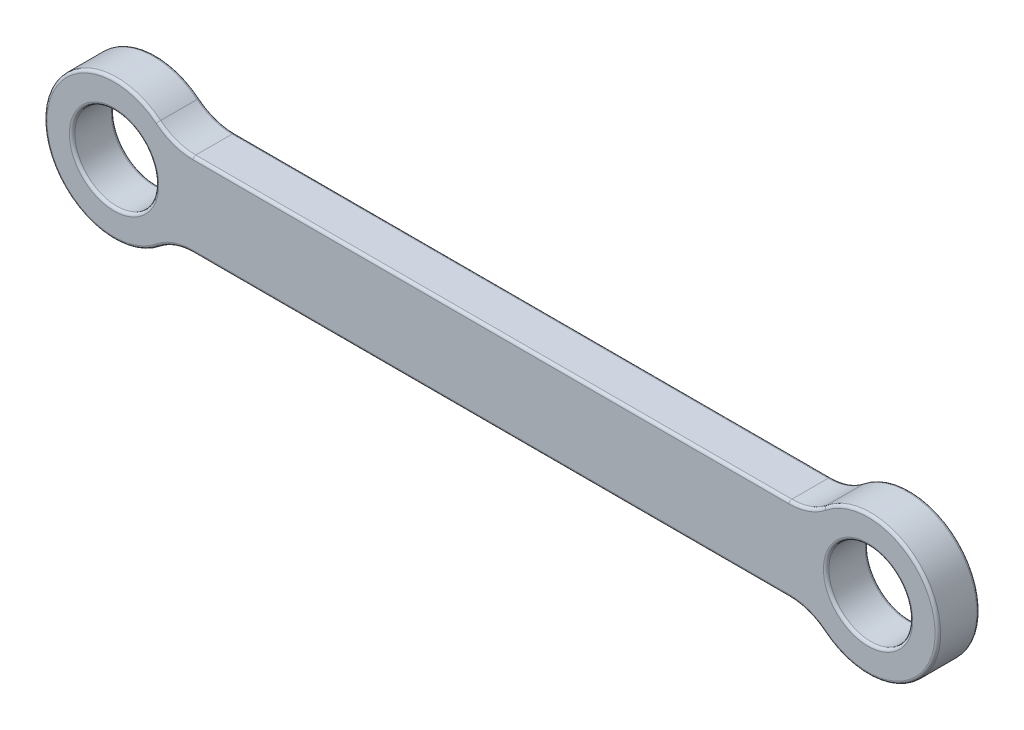
ISO-10303-21;
HEADER;
FILE_DESCRIPTION(('STEP AP214'),'2;1');
FILE_NAME('part.step','',(''),(''),'','','');
FILE_SCHEMA(('AUTOMOTIVE_DESIGN { 1 0 10303 214 1 1 1 1 }'));
ENDSEC;
DATA;
#1=APPLICATION_CONTEXT('core data for automotive mechanical design processes');
#2=APPLICATION_PROTOCOL_DEFINITION('international standard','automotive_design',2000,#1);
#3=PRODUCT_CONTEXT('',#1,'mechanical');
#4=PRODUCT('Part','Part','',(#3));
#5=PRODUCT_RELATED_PRODUCT_CATEGORY('part','',(#4));
#6=PRODUCT_DEFINITION_FORMATION('','',#4);
#7=PRODUCT_DEFINITION_CONTEXT('part definition',#1,'design');
#8=PRODUCT_DEFINITION('design','',#6,#7);
#9=PRODUCT_DEFINITION_SHAPE('','',#8);
#10=(LENGTH_UNIT() NAMED_UNIT(*) SI_UNIT(.MILLI.,.METRE.));
#11=(NAMED_UNIT(*) PLANE_ANGLE_UNIT() SI_UNIT($,.RADIAN.));
#12=(NAMED_UNIT(*) SI_UNIT($,.STERADIAN.) SOLID_ANGLE_UNIT());
#13=UNCERTAINTY_MEASURE_WITH_UNIT(LENGTH_MEASURE(1.E-05),#10,'distance_accuracy_value','');
#14=(GEOMETRIC_REPRESENTATION_CONTEXT(3) GLOBAL_UNCERTAINTY_ASSIGNED_CONTEXT((#13)) GLOBAL_UNIT_ASSIGNED_CONTEXT((#10,
#11,#12)) REPRESENTATION_CONTEXT('',''));
#15=CARTESIAN_POINT('',(0.,0.,0.));
#16=DIRECTION('',(0.,0.,1.));
#17=DIRECTION('',(1.,0.,0.));
#18=AXIS2_PLACEMENT_3D('',#15,#16,#17);
#19=CARTESIAN_POINT('',(0.,0.,3.));
#20=DIRECTION('',(0.,0.,-1.));
#21=DIRECTION('',(-1.,0.,0.));
#22=AXIS2_PLACEMENT_3D('',#19,#20,#21);
#23=CYLINDRICAL_SURFACE('',#22,5.);
#24=DIRECTION('',(0.,0.,-1.));
#25=VECTOR('',#24,1.);
#26=CARTESIAN_POINT('',(3.14269680527354,3.88888888888889,3.));
#27=LINE('',#26,#25);
#28=CARTESIAN_POINT('',(3.14269680527354,3.88888888888889,2.8));
#29=VERTEX_POINT('',#28);
#30=CARTESIAN_POINT('',(3.14269680527354,3.88888888888889,0.2));
#31=VERTEX_POINT('',#30);
#32=EDGE_CURVE('E304',#29,#31,#27,.T.);
#33=ORIENTED_EDGE('',*,*,#32,.T.);
#34=CARTESIAN_POINT('',(0.,0.,0.2));
#35=DIRECTION('',(0.,0.,1.));
#36=DIRECTION('',(1.,0.,0.));
#37=AXIS2_PLACEMENT_3D('',#34,#35,#36);
#38=CIRCLE('',#37,5.);
#39=CARTESIAN_POINT('',(3.14269680527354,-3.88888888888889,0.2));
#40=VERTEX_POINT('',#39);
#41=EDGE_CURVE('E218',#31,#40,#38,.T.);
#42=ORIENTED_EDGE('',*,*,#41,.T.);
#43=DIRECTION('',(0.,0.,-1.));
#44=VECTOR('',#43,1.);
#45=CARTESIAN_POINT('',(3.14269680527354,-3.88888888888889,3.));
#46=LINE('',#45,#44);
#47=CARTESIAN_POINT('',(3.14269680527354,-3.88888888888889,2.8));
#48=VERTEX_POINT('',#47);
#49=EDGE_CURVE('E297',#40,#48,#46,.F.);
#50=ORIENTED_EDGE('',*,*,#49,.T.);
#51=CARTESIAN_POINT('',(0.,0.,2.8));
#52=DIRECTION('',(0.,0.,1.));
#53=DIRECTION('',(1.,0.,0.));
#54=AXIS2_PLACEMENT_3D('',#51,#52,#53);
#55=CIRCLE('',#54,5.);
#56=EDGE_CURVE('E216',#48,#29,#55,.F.);
#57=ORIENTED_EDGE('',*,*,#56,.T.);
#58=EDGE_LOOP('',(#33,#42,#50,#57));
#59=FACE_BOUND('',#58,.T.);
#60=ADVANCED_FACE('F38',(#59),#23,.T.);
#61=CARTESIAN_POINT('',(0.,-3.,3.));
#62=DIRECTION('',(0.,-1.,0.));
#63=DIRECTION('',(0.,0.,-1.));
#64=AXIS2_PLACEMENT_3D('',#61,#62,#63);
#65=PLANE('',#64);
#66=DIRECTION('',(0.,0.,-1.));
#67=VECTOR('',#66,1.);
#68=CARTESIAN_POINT('',(5.65685424949238,-3.,3.));
#69=LINE('',#68,#67);
#70=CARTESIAN_POINT('',(5.65685424949238,-3.,2.8));
#71=VERTEX_POINT('',#70);
#72=CARTESIAN_POINT('',(5.65685424949238,-3.,0.2));
#73=VERTEX_POINT('',#72);
#74=EDGE_CURVE('E299',#71,#73,#69,.T.);
#75=ORIENTED_EDGE('',*,*,#74,.T.);
#76=DIRECTION('',(-1.,0.,0.));
#77=VECTOR('',#76,1.);
#78=CARTESIAN_POINT('',(48.3431457505076,-3.,0.2));
#79=LINE('',#78,#77);
#80=CARTESIAN_POINT('',(48.3431457505076,-3.,0.2));
#81=VERTEX_POINT('',#80);
#82=EDGE_CURVE('E193',#73,#81,#79,.F.);
#83=ORIENTED_EDGE('',*,*,#82,.T.);
#84=DIRECTION('',(0.,0.,1.));
#85=VECTOR('',#84,1.);
#86=CARTESIAN_POINT('',(48.3431457505076,-3.,3.));
#87=LINE('',#86,#85);
#88=CARTESIAN_POINT('',(48.3431457505076,-3.,2.8));
#89=VERTEX_POINT('',#88);
#90=EDGE_CURVE('E309',#81,#89,#87,.T.);
#91=ORIENTED_EDGE('',*,*,#90,.T.);
#92=DIRECTION('',(-1.,0.,0.));
#93=VECTOR('',#92,1.);
#94=CARTESIAN_POINT('',(0.,-3.,2.8));
#95=LINE('',#94,#93);
#96=EDGE_CURVE('E191',#89,#71,#95,.T.);
#97=ORIENTED_EDGE('',*,*,#96,.T.);
#98=EDGE_LOOP('',(#75,#83,#91,#97));
#99=FACE_BOUND('',#98,.T.);
#100=ADVANCED_FACE('F342',(#99),#65,.T.);
#101=CARTESIAN_POINT('',(54.,0.,3.));
#102=DIRECTION('',(0.,0.,-1.));
#103=DIRECTION('',(-1.,0.,0.));
#104=AXIS2_PLACEMENT_3D('',#101,#102,#103);
#105=CYLINDRICAL_SURFACE('',#104,5.);
#106=DIRECTION('',(0.,0.,-1.));
#107=VECTOR('',#106,1.);
#108=CARTESIAN_POINT('',(50.8573031947265,-3.88888888888889,3.));
#109=LINE('',#108,#107);
#110=CARTESIAN_POINT('',(50.8573031947265,-3.88888888888889,2.8));
#111=VERTEX_POINT('',#110);
#112=CARTESIAN_POINT('',(50.8573031947265,-3.88888888888889,0.2));
#113=VERTEX_POINT('',#112);
#114=EDGE_CURVE('E343',#111,#113,#109,.T.);
#115=ORIENTED_EDGE('',*,*,#114,.T.);
#116=CARTESIAN_POINT('',(54.,0.,0.2));
#117=DIRECTION('',(0.,0.,1.));
#118=DIRECTION('',(1.,0.,0.));
#119=AXIS2_PLACEMENT_3D('',#116,#117,#118);
#120=CIRCLE('',#119,5.);
#121=CARTESIAN_POINT('',(50.8573031947265,3.88888888888889,0.2));
#122=VERTEX_POINT('',#121);
#123=EDGE_CURVE('E201',#113,#122,#120,.T.);
#124=ORIENTED_EDGE('',*,*,#123,.T.);
#125=DIRECTION('',(0.,0.,-1.));
#126=VECTOR('',#125,1.);
#127=CARTESIAN_POINT('',(50.8573031947265,3.88888888888889,3.));
#128=LINE('',#127,#126);
#129=CARTESIAN_POINT('',(50.8573031947265,3.88888888888889,2.8));
#130=VERTEX_POINT('',#129);
#131=EDGE_CURVE('E259',#122,#130,#128,.F.);
#132=ORIENTED_EDGE('',*,*,#131,.T.);
#133=CARTESIAN_POINT('',(54.,0.,2.8));
#134=DIRECTION('',(0.,0.,1.));
#135=DIRECTION('',(1.,0.,0.));
#136=AXIS2_PLACEMENT_3D('',#133,#134,#135);
#137=CIRCLE('',#136,5.);
#138=EDGE_CURVE('E199',#130,#111,#137,.F.);
#139=ORIENTED_EDGE('',*,*,#138,.T.);
#140=EDGE_LOOP('',(#115,#124,#132,#139));
#141=FACE_BOUND('',#140,.T.);
#142=ADVANCED_FACE('F351',(#141),#105,.T.);
#143=CARTESIAN_POINT('',(0.,3.,3.));
#144=DIRECTION('',(0.,-1.,0.));
#145=DIRECTION('',(0.,0.,-1.));
#146=AXIS2_PLACEMENT_3D('',#143,#144,#145);
#147=PLANE('',#146);
#148=DIRECTION('',(0.,0.,-1.));
#149=VECTOR('',#148,1.);
#150=CARTESIAN_POINT('',(48.3431457505076,3.,3.));
#151=LINE('',#150,#149);
#152=CARTESIAN_POINT('',(48.3431457505076,3.,2.8));
#153=VERTEX_POINT('',#152);
#154=CARTESIAN_POINT('',(48.3431457505076,3.,0.2));
#155=VERTEX_POINT('',#154);
#156=EDGE_CURVE('E307',#153,#155,#151,.T.);
#157=ORIENTED_EDGE('',*,*,#156,.T.);
#158=DIRECTION('',(-1.,0.,0.));
#159=VECTOR('',#158,1.);
#160=CARTESIAN_POINT('',(0.,3.,0.2));
#161=LINE('',#160,#159);
#162=CARTESIAN_POINT('',(5.65685424949238,3.,0.2));
#163=VERTEX_POINT('',#162);
#164=EDGE_CURVE('E210',#155,#163,#161,.T.);
#165=ORIENTED_EDGE('',*,*,#164,.T.);
#166=DIRECTION('',(0.,0.,1.));
#167=VECTOR('',#166,1.);
#168=CARTESIAN_POINT('',(5.65685424949238,3.,3.));
#169=LINE('',#168,#167);
#170=CARTESIAN_POINT('',(5.65685424949238,3.,2.8));
#171=VERTEX_POINT('',#170);
#172=EDGE_CURVE('E303',#163,#171,#169,.T.);
#173=ORIENTED_EDGE('',*,*,#172,.T.);
#174=DIRECTION('',(-1.,0.,0.));
#175=VECTOR('',#174,1.);
#176=CARTESIAN_POINT('',(48.3431457505076,3.,2.8));
#177=LINE('',#176,#175);
#178=EDGE_CURVE('E208',#171,#153,#177,.F.);
#179=ORIENTED_EDGE('',*,*,#178,.T.);
#180=EDGE_LOOP('',(#157,#165,#173,#179));
#181=FACE_BOUND('',#180,.T.);
#182=ADVANCED_FACE('F391',(#181),#147,.F.);
#183=CARTESIAN_POINT('',(0.,0.,3.));
#184=DIRECTION('',(0.,0.,-1.));
#185=DIRECTION('',(-1.,0.,0.));
#186=AXIS2_PLACEMENT_3D('',#183,#184,#185);
#187=CYLINDRICAL_SURFACE('',#186,3.);
#188=CARTESIAN_POINT('',(0.,0.,0.2));
#189=DIRECTION('',(0.,0.,1.));
#190=DIRECTION('',(1.,0.,0.));
#191=AXIS2_PLACEMENT_3D('',#188,#189,#190);
#192=CIRCLE('',#191,3.);
#193=CARTESIAN_POINT('',(3.,0.,0.2));
#194=VERTEX_POINT('',#193);
#195=EDGE_CURVE('E223',#194,#194,#192,.F.);
#196=ORIENTED_EDGE('',*,*,#195,.T.);
#197=EDGE_LOOP('',(#196));
#198=FACE_BOUND('',#197,.T.);
#199=CARTESIAN_POINT('',(0.,0.,2.8));
#200=DIRECTION('',(0.,0.,1.));
#201=DIRECTION('',(1.,0.,0.));
#202=AXIS2_PLACEMENT_3D('',#199,#200,#201);
#203=CIRCLE('',#202,3.);
#204=CARTESIAN_POINT('',(3.,0.,2.8));
#205=VERTEX_POINT('',#204);
#206=EDGE_CURVE('E220',#205,#205,#203,.T.);
#207=ORIENTED_EDGE('',*,*,#206,.T.);
#208=EDGE_LOOP('',(#207));
#209=FACE_BOUND('',#208,.T.);
#210=ADVANCED_FACE('F387',(#198,#209),#187,.F.);
#211=CARTESIAN_POINT('',(54.,0.,3.));
#212=DIRECTION('',(0.,0.,-1.));
#213=DIRECTION('',(-1.,0.,0.));
#214=AXIS2_PLACEMENT_3D('',#211,#212,#213);
#215=CYLINDRICAL_SURFACE('',#214,3.);
#216=CARTESIAN_POINT('',(54.,0.,0.2));
#217=DIRECTION('',(0.,0.,1.));
#218=DIRECTION('',(1.,0.,0.));
#219=AXIS2_PLACEMENT_3D('',#216,#217,#218);
#220=CIRCLE('',#219,3.);
#221=CARTESIAN_POINT('',(57.,0.,0.2));
#222=VERTEX_POINT('',#221);
#223=EDGE_CURVE('E318',#222,#222,#220,.F.);
#224=ORIENTED_EDGE('',*,*,#223,.T.);
#225=EDGE_LOOP('',(#224));
#226=FACE_BOUND('',#225,.T.);
#227=CARTESIAN_POINT('',(54.,0.,2.8));
#228=DIRECTION('',(0.,0.,1.));
#229=DIRECTION('',(1.,0.,0.));
#230=AXIS2_PLACEMENT_3D('',#227,#228,#229);
#231=CIRCLE('',#230,3.);
#232=CARTESIAN_POINT('',(57.,0.,2.8));
#233=VERTEX_POINT('',#232);
#234=EDGE_CURVE('E315',#233,#233,#231,.T.);
#235=ORIENTED_EDGE('',*,*,#234,.T.);
#236=EDGE_LOOP('',(#235));
#237=FACE_BOUND('',#236,.T.);
#238=ADVANCED_FACE('F390',(#226,#237),#215,.F.);
#239=CARTESIAN_POINT('',(0.,0.,3.));
#240=DIRECTION('',(0.,0.,1.));
#241=DIRECTION('',(1.,0.,0.));
#242=AXIS2_PLACEMENT_3D('',#239,#240,#241);
#243=PLANE('',#242);
#244=CARTESIAN_POINT('',(54.,0.,3.));
#245=DIRECTION('',(0.,0.,1.));
#246=DIRECTION('',(1.,0.,0.));
#247=AXIS2_PLACEMENT_3D('',#244,#245,#246);
#248=CIRCLE('',#247,3.2);
#249=CARTESIAN_POINT('',(57.2,0.,3.));
#250=VERTEX_POINT('',#249);
#251=EDGE_CURVE('E11',#250,#250,#248,.F.);
#252=ORIENTED_EDGE('',*,*,#251,.T.);
#253=EDGE_LOOP('',(#252));
#254=FACE_BOUND('',#253,.T.);
#255=CARTESIAN_POINT('',(54.,0.,3.));
#256=DIRECTION('',(0.,0.,1.));
#257=DIRECTION('',(1.,0.,0.));
#258=AXIS2_PLACEMENT_3D('',#255,#256,#257);
#259=CIRCLE('',#258,4.8);
#260=CARTESIAN_POINT('',(50.9830110669374,-3.73333333333333,3.));
#261=VERTEX_POINT('',#260);
#262=CARTESIAN_POINT('',(50.9830110669374,3.73333333333333,3.));
#263=VERTEX_POINT('',#262);
#264=EDGE_CURVE('E55',#261,#263,#259,.T.);
#265=ORIENTED_EDGE('',*,*,#264,.T.);
#266=CARTESIAN_POINT('',(48.3431457505076,7.,3.));
#267=DIRECTION('',(0.,0.,1.));
#268=DIRECTION('',(1.,0.,0.));
#269=AXIS2_PLACEMENT_3D('',#266,#267,#268);
#270=CIRCLE('',#269,4.2);
#271=CARTESIAN_POINT('',(48.3431457505076,2.8,3.));
#272=VERTEX_POINT('',#271);
#273=EDGE_CURVE('E47',#263,#272,#270,.F.);
#274=ORIENTED_EDGE('',*,*,#273,.T.);
#275=DIRECTION('',(-1.,0.,0.));
#276=VECTOR('',#275,1.);
#277=CARTESIAN_POINT('',(5.65685424949238,2.8,3.));
#278=LINE('',#277,#276);
#279=CARTESIAN_POINT('',(5.65685424949238,2.8,3.));
#280=VERTEX_POINT('',#279);
#281=EDGE_CURVE('E229',#272,#280,#278,.T.);
#282=ORIENTED_EDGE('',*,*,#281,.T.);
#283=CARTESIAN_POINT('',(5.65685424949238,7.,3.));
#284=DIRECTION('',(0.,0.,1.));
#285=DIRECTION('',(1.,0.,0.));
#286=AXIS2_PLACEMENT_3D('',#283,#284,#285);
#287=CIRCLE('',#286,4.2);
#288=CARTESIAN_POINT('',(3.0169889330626,3.73333333333333,3.));
#289=VERTEX_POINT('',#288);
#290=EDGE_CURVE('E231',#280,#289,#287,.F.);
#291=ORIENTED_EDGE('',*,*,#290,.T.);
#292=CARTESIAN_POINT('',(0.,0.,3.));
#293=DIRECTION('',(0.,0.,1.));
#294=DIRECTION('',(1.,0.,0.));
#295=AXIS2_PLACEMENT_3D('',#292,#293,#294);
#296=CIRCLE('',#295,4.8);
#297=CARTESIAN_POINT('',(3.0169889330626,-3.73333333333333,3.));
#298=VERTEX_POINT('',#297);
#299=EDGE_CURVE('E233',#289,#298,#296,.T.);
#300=ORIENTED_EDGE('',*,*,#299,.T.);
#301=CARTESIAN_POINT('',(5.65685424949238,-7.,3.));
#302=DIRECTION('',(0.,0.,1.));
#303=DIRECTION('',(1.,0.,0.));
#304=AXIS2_PLACEMENT_3D('',#301,#302,#303);
#305=CIRCLE('',#304,4.2);
#306=CARTESIAN_POINT('',(5.65685424949238,-2.8,3.));
#307=VERTEX_POINT('',#306);
#308=EDGE_CURVE('E235',#298,#307,#305,.F.);
#309=ORIENTED_EDGE('',*,*,#308,.T.);
#310=DIRECTION('',(-1.,0.,0.));
#311=VECTOR('',#310,1.);
#312=CARTESIAN_POINT('',(0.,-2.8,3.));
#313=LINE('',#312,#311);
#314=CARTESIAN_POINT('',(48.3431457505076,-2.8,3.));
#315=VERTEX_POINT('',#314);
#316=EDGE_CURVE('E237',#307,#315,#313,.F.);
#317=ORIENTED_EDGE('',*,*,#316,.T.);
#318=CARTESIAN_POINT('',(48.3431457505076,-7.,3.));
#319=DIRECTION('',(0.,0.,1.));
#320=DIRECTION('',(1.,0.,0.));
#321=AXIS2_PLACEMENT_3D('',#318,#319,#320);
#322=CIRCLE('',#321,4.2);
#323=EDGE_CURVE('E60',#315,#261,#322,.F.);
#324=ORIENTED_EDGE('',*,*,#323,.T.);
#325=EDGE_LOOP('',(#265,#274,#282,#291,#300,#309,#317,#324));
#326=FACE_BOUND('',#325,.T.);
#327=CARTESIAN_POINT('',(0.,0.,3.));
#328=DIRECTION('',(0.,0.,1.));
#329=DIRECTION('',(1.,0.,0.));
#330=AXIS2_PLACEMENT_3D('',#327,#328,#329);
#331=CIRCLE('',#330,3.2);
#332=CARTESIAN_POINT('',(3.2,0.,3.));
#333=VERTEX_POINT('',#332);
#334=EDGE_CURVE('E226',#333,#333,#331,.F.);
#335=ORIENTED_EDGE('',*,*,#334,.T.);
#336=EDGE_LOOP('',(#335));
#337=FACE_BOUND('',#336,.T.);
#338=ADVANCED_FACE('F597',(#254,#326,#337),#243,.T.);
#339=CARTESIAN_POINT('',(0.,0.,0.));
#340=DIRECTION('',(0.,0.,1.));
#341=DIRECTION('',(1.,0.,0.));
#342=AXIS2_PLACEMENT_3D('',#339,#340,#341);
#343=PLANE('',#342);
#344=CARTESIAN_POINT('',(54.,0.,0.));
#345=DIRECTION('',(0.,0.,1.));
#346=DIRECTION('',(1.,0.,0.));
#347=AXIS2_PLACEMENT_3D('',#344,#345,#346);
#348=CIRCLE('',#347,3.2);
#349=CARTESIAN_POINT('',(57.2,0.,0.));
#350=VERTEX_POINT('',#349);
#351=EDGE_CURVE('E180',#350,#350,#348,.T.);
#352=ORIENTED_EDGE('',*,*,#351,.T.);
#353=EDGE_LOOP('',(#352));
#354=FACE_BOUND('',#353,.T.);
#355=DIRECTION('',(-1.,0.,0.));
#356=VECTOR('',#355,1.);
#357=CARTESIAN_POINT('',(5.65685424949238,-2.8,0.));
#358=LINE('',#357,#356);
#359=CARTESIAN_POINT('',(48.3431457505076,-2.8,0.));
#360=VERTEX_POINT('',#359);
#361=CARTESIAN_POINT('',(5.65685424949238,-2.8,0.));
#362=VERTEX_POINT('',#361);
#363=EDGE_CURVE('E178',#360,#362,#358,.T.);
#364=ORIENTED_EDGE('',*,*,#363,.T.);
#365=CARTESIAN_POINT('',(5.65685424949238,-7.,0.));
#366=DIRECTION('',(0.,0.,1.));
#367=DIRECTION('',(1.,0.,0.));
#368=AXIS2_PLACEMENT_3D('',#365,#366,#367);
#369=CIRCLE('',#368,4.2);
#370=CARTESIAN_POINT('',(3.0169889330626,-3.73333333333333,0.));
#371=VERTEX_POINT('',#370);
#372=EDGE_CURVE('E158',#362,#371,#369,.T.);
#373=ORIENTED_EDGE('',*,*,#372,.T.);
#374=CARTESIAN_POINT('',(0.,0.,0.));
#375=DIRECTION('',(0.,0.,1.));
#376=DIRECTION('',(1.,0.,0.));
#377=AXIS2_PLACEMENT_3D('',#374,#375,#376);
#378=CIRCLE('',#377,4.8);
#379=CARTESIAN_POINT('',(3.0169889330626,3.73333333333333,0.));
#380=VERTEX_POINT('',#379);
#381=EDGE_CURVE('E166',#371,#380,#378,.F.);
#382=ORIENTED_EDGE('',*,*,#381,.T.);
#383=CARTESIAN_POINT('',(5.65685424949238,7.,0.));
#384=DIRECTION('',(0.,0.,1.));
#385=DIRECTION('',(1.,0.,0.));
#386=AXIS2_PLACEMENT_3D('',#383,#384,#385);
#387=CIRCLE('',#386,4.2);
#388=CARTESIAN_POINT('',(5.65685424949238,2.8,0.));
#389=VERTEX_POINT('',#388);
#390=EDGE_CURVE('E172',#380,#389,#387,.T.);
#391=ORIENTED_EDGE('',*,*,#390,.T.);
#392=DIRECTION('',(-1.,0.,0.));
#393=VECTOR('',#392,1.);
#394=CARTESIAN_POINT('',(0.,2.8,0.));
#395=LINE('',#394,#393);
#396=CARTESIAN_POINT('',(48.3431457505076,2.8,0.));
#397=VERTEX_POINT('',#396);
#398=EDGE_CURVE('E324',#389,#397,#395,.F.);
#399=ORIENTED_EDGE('',*,*,#398,.T.);
#400=CARTESIAN_POINT('',(48.3431457505076,7.,0.));
#401=DIRECTION('',(0.,0.,1.));
#402=DIRECTION('',(1.,0.,0.));
#403=AXIS2_PLACEMENT_3D('',#400,#401,#402);
#404=CIRCLE('',#403,4.2);
#405=CARTESIAN_POINT('',(50.9830110669374,3.73333333333333,0.));
#406=VERTEX_POINT('',#405);
#407=EDGE_CURVE('E326',#397,#406,#404,.T.);
#408=ORIENTED_EDGE('',*,*,#407,.T.);
#409=CARTESIAN_POINT('',(54.,0.,0.));
#410=DIRECTION('',(0.,0.,1.));
#411=DIRECTION('',(1.,0.,0.));
#412=AXIS2_PLACEMENT_3D('',#409,#410,#411);
#413=CIRCLE('',#412,4.8);
#414=CARTESIAN_POINT('',(50.9830110669374,-3.73333333333333,0.));
#415=VERTEX_POINT('',#414);
#416=EDGE_CURVE('E328',#406,#415,#413,.F.);
#417=ORIENTED_EDGE('',*,*,#416,.T.);
#418=CARTESIAN_POINT('',(48.3431457505076,-7.,0.));
#419=DIRECTION('',(0.,0.,1.));
#420=DIRECTION('',(1.,0.,0.));
#421=AXIS2_PLACEMENT_3D('',#418,#419,#420);
#422=CIRCLE('',#421,4.2);
#423=EDGE_CURVE('E185',#415,#360,#422,.T.);
#424=ORIENTED_EDGE('',*,*,#423,.T.);
#425=EDGE_LOOP('',(#364,#373,#382,#391,#399,#408,#417,#424));
#426=FACE_BOUND('',#425,.T.);
#427=CARTESIAN_POINT('',(0.,0.,0.));
#428=DIRECTION('',(0.,0.,1.));
#429=DIRECTION('',(1.,0.,0.));
#430=AXIS2_PLACEMENT_3D('',#427,#428,#429);
#431=CIRCLE('',#430,3.2);
#432=CARTESIAN_POINT('',(3.2,0.,0.));
#433=VERTEX_POINT('',#432);
#434=EDGE_CURVE('E173',#433,#433,#431,.T.);
#435=ORIENTED_EDGE('',*,*,#434,.T.);
#436=EDGE_LOOP('',(#435));
#437=FACE_BOUND('',#436,.T.);
#438=ADVANCED_FACE('F175',(#354,#426,#437),#343,.F.);
#439=CARTESIAN_POINT('',(48.3431457505076,-7.,3.));
#440=DIRECTION('',(0.,0.,-1.));
#441=DIRECTION('',(-1.,0.,0.));
#442=AXIS2_PLACEMENT_3D('',#439,#440,#441);
#443=CYLINDRICAL_SURFACE('',#442,4.);
#444=ORIENTED_EDGE('',*,*,#90,.F.);
#445=CARTESIAN_POINT('',(48.3431457505076,-7.,0.2));
#446=DIRECTION('',(0.,0.,1.));
#447=DIRECTION('',(1.,0.,0.));
#448=AXIS2_PLACEMENT_3D('',#445,#446,#447);
#449=CIRCLE('',#448,4.);
#450=EDGE_CURVE('E197',#81,#113,#449,.F.);
#451=ORIENTED_EDGE('',*,*,#450,.T.);
#452=ORIENTED_EDGE('',*,*,#114,.F.);
#453=CARTESIAN_POINT('',(48.3431457505076,-7.,2.8));
#454=DIRECTION('',(0.,0.,1.));
#455=DIRECTION('',(1.,0.,0.));
#456=AXIS2_PLACEMENT_3D('',#453,#454,#455);
#457=CIRCLE('',#456,4.);
#458=EDGE_CURVE('E195',#111,#89,#457,.T.);
#459=ORIENTED_EDGE('',*,*,#458,.T.);
#460=EDGE_LOOP('',(#444,#451,#452,#459));
#461=FACE_BOUND('',#460,.T.);
#462=ADVANCED_FACE('F393',(#461),#443,.F.);
#463=CARTESIAN_POINT('',(5.65685424949238,-7.,3.));
#464=DIRECTION('',(0.,0.,-1.));
#465=DIRECTION('',(-1.,0.,0.));
#466=AXIS2_PLACEMENT_3D('',#463,#464,#465);
#467=CYLINDRICAL_SURFACE('',#466,4.);
#468=ORIENTED_EDGE('',*,*,#49,.F.);
#469=CARTESIAN_POINT('',(5.65685424949238,-7.,0.2));
#470=DIRECTION('',(0.,0.,1.));
#471=DIRECTION('',(1.,0.,0.));
#472=AXIS2_PLACEMENT_3D('',#469,#470,#471);
#473=CIRCLE('',#472,4.);
#474=EDGE_CURVE('E160',#40,#73,#473,.F.);
#475=ORIENTED_EDGE('',*,*,#474,.T.);
#476=ORIENTED_EDGE('',*,*,#74,.F.);
#477=CARTESIAN_POINT('',(5.65685424949238,-7.,2.8));
#478=DIRECTION('',(0.,0.,1.));
#479=DIRECTION('',(1.,0.,0.));
#480=AXIS2_PLACEMENT_3D('',#477,#478,#479);
#481=CIRCLE('',#480,4.);
#482=EDGE_CURVE('E183',#71,#48,#481,.T.);
#483=ORIENTED_EDGE('',*,*,#482,.T.);
#484=EDGE_LOOP('',(#468,#475,#476,#483));
#485=FACE_BOUND('',#484,.T.);
#486=ADVANCED_FACE('F296',(#485),#467,.F.);
#487=CARTESIAN_POINT('',(48.3431457505076,7.,3.));
#488=DIRECTION('',(0.,0.,-1.));
#489=DIRECTION('',(-1.,0.,0.));
#490=AXIS2_PLACEMENT_3D('',#487,#488,#489);
#491=CYLINDRICAL_SURFACE('',#490,4.);
#492=ORIENTED_EDGE('',*,*,#131,.F.);
#493=CARTESIAN_POINT('',(48.3431457505076,7.,0.2));
#494=DIRECTION('',(0.,0.,1.));
#495=DIRECTION('',(1.,0.,0.));
#496=AXIS2_PLACEMENT_3D('',#493,#494,#495);
#497=CIRCLE('',#496,4.);
#498=EDGE_CURVE('E206',#122,#155,#497,.F.);
#499=ORIENTED_EDGE('',*,*,#498,.T.);
#500=ORIENTED_EDGE('',*,*,#156,.F.);
#501=CARTESIAN_POINT('',(48.3431457505076,7.,2.8));
#502=DIRECTION('',(0.,0.,1.));
#503=DIRECTION('',(1.,0.,0.));
#504=AXIS2_PLACEMENT_3D('',#501,#502,#503);
#505=CIRCLE('',#504,4.);
#506=EDGE_CURVE('E203',#153,#130,#505,.T.);
#507=ORIENTED_EDGE('',*,*,#506,.T.);
#508=EDGE_LOOP('',(#492,#499,#500,#507));
#509=FACE_BOUND('',#508,.T.);
#510=ADVANCED_FACE('F357',(#509),#491,.F.);
#511=CARTESIAN_POINT('',(5.65685424949238,7.,3.));
#512=DIRECTION('',(0.,0.,-1.));
#513=DIRECTION('',(-1.,0.,0.));
#514=AXIS2_PLACEMENT_3D('',#511,#512,#513);
#515=CYLINDRICAL_SURFACE('',#514,4.);
#516=ORIENTED_EDGE('',*,*,#172,.F.);
#517=CARTESIAN_POINT('',(5.65685424949238,7.,0.2));
#518=DIRECTION('',(0.,0.,1.));
#519=DIRECTION('',(1.,0.,0.));
#520=AXIS2_PLACEMENT_3D('',#517,#518,#519);
#521=CIRCLE('',#520,4.);
#522=EDGE_CURVE('E214',#163,#31,#521,.F.);
#523=ORIENTED_EDGE('',*,*,#522,.T.);
#524=ORIENTED_EDGE('',*,*,#32,.F.);
#525=CARTESIAN_POINT('',(5.65685424949238,7.,2.8));
#526=DIRECTION('',(0.,0.,1.));
#527=DIRECTION('',(1.,0.,0.));
#528=AXIS2_PLACEMENT_3D('',#525,#526,#527);
#529=CIRCLE('',#528,4.);
#530=EDGE_CURVE('E212',#29,#171,#529,.T.);
#531=ORIENTED_EDGE('',*,*,#530,.T.);
#532=EDGE_LOOP('',(#516,#523,#524,#531));
#533=FACE_BOUND('',#532,.T.);
#534=ADVANCED_FACE('F401',(#533),#515,.F.);
#535=CARTESIAN_POINT('',(54.,0.,0.2));
#536=DIRECTION('',(0.,0.,1.));
#537=DIRECTION('',(1.,0.,0.));
#538=AXIS2_PLACEMENT_3D('',#535,#536,#537);
#539=TOROIDAL_SURFACE('',#538,3.2,0.2);
#540=ORIENTED_EDGE('',*,*,#351,.F.);
#541=EDGE_LOOP('',(#540));
#542=FACE_BOUND('',#541,.T.);
#543=ORIENTED_EDGE('',*,*,#223,.F.);
#544=EDGE_LOOP('',(#543));
#545=FACE_BOUND('',#544,.T.);
#546=ADVANCED_FACE('F377',(#542,#545),#539,.T.);
#547=CARTESIAN_POINT('',(48.3431457505076,7.,0.2));
#548=DIRECTION('',(0.,0.,1.));
#549=DIRECTION('',(1.,0.,0.));
#550=AXIS2_PLACEMENT_3D('',#547,#548,#549);
#551=TOROIDAL_SURFACE('',#550,4.2,0.2);
#552=CARTESIAN_POINT('',(48.3431457505076,2.8,0.2));
#553=DIRECTION('',(-1.,0.,0.));
#554=DIRECTION('',(0.,0.,1.));
#555=AXIS2_PLACEMENT_3D('',#552,#553,#554);
#556=CIRCLE('',#555,0.2);
#557=EDGE_CURVE('E253',#155,#397,#556,.T.);
#558=ORIENTED_EDGE('',*,*,#557,.F.);
#559=ORIENTED_EDGE('',*,*,#498,.F.);
#560=CARTESIAN_POINT('',(50.9830110669374,3.73333333333333,0.2));
#561=DIRECTION('',(0.777777777777765,0.628539361054724,0.));
#562=DIRECTION('',(-0.628539361054724,0.777777777777765,0.));
#563=AXIS2_PLACEMENT_3D('',#560,#561,#562);
#564=CIRCLE('',#563,0.2);
#565=EDGE_CURVE('E256',#406,#122,#564,.T.);
#566=ORIENTED_EDGE('',*,*,#565,.F.);
#567=ORIENTED_EDGE('',*,*,#407,.F.);
#568=EDGE_LOOP('',(#558,#559,#566,#567));
#569=FACE_BOUND('',#568,.T.);
#570=ADVANCED_FACE('F363',(#569),#551,.T.);
#571=CARTESIAN_POINT('',(54.,0.,0.2));
#572=DIRECTION('',(0.,0.,1.));
#573=DIRECTION('',(1.,0.,0.));
#574=AXIS2_PLACEMENT_3D('',#571,#572,#573);
#575=TOROIDAL_SURFACE('',#574,4.8,0.2);
#576=ORIENTED_EDGE('',*,*,#565,.T.);
#577=ORIENTED_EDGE('',*,*,#123,.F.);
#578=CARTESIAN_POINT('',(50.9830110669374,-3.73333333333333,0.2));
#579=DIRECTION('',(-0.777777777777764,0.628539361054726,0.));
#580=DIRECTION('',(-0.628539361054726,-0.777777777777764,0.));
#581=AXIS2_PLACEMENT_3D('',#578,#579,#580);
#582=CIRCLE('',#581,0.2);
#583=EDGE_CURVE('E250',#415,#113,#582,.T.);
#584=ORIENTED_EDGE('',*,*,#583,.F.);
#585=ORIENTED_EDGE('',*,*,#416,.F.);
#586=EDGE_LOOP('',(#576,#577,#584,#585));
#587=FACE_BOUND('',#586,.T.);
#588=ADVANCED_FACE('F367',(#587),#575,.T.);
#589=CARTESIAN_POINT('',(0.,2.8,0.2));
#590=DIRECTION('',(-1.,0.,0.));
#591=DIRECTION('',(0.,0.,1.));
#592=AXIS2_PLACEMENT_3D('',#589,#590,#591);
#593=CYLINDRICAL_SURFACE('',#592,0.2);
#594=ORIENTED_EDGE('',*,*,#557,.T.);
#595=ORIENTED_EDGE('',*,*,#398,.F.);
#596=CARTESIAN_POINT('',(5.65685424949238,2.8,0.2));
#597=DIRECTION('',(-1.,0.,0.));
#598=DIRECTION('',(0.,0.,1.));
#599=AXIS2_PLACEMENT_3D('',#596,#597,#598);
#600=CIRCLE('',#599,0.2);
#601=EDGE_CURVE('E247',#163,#389,#600,.T.);
#602=ORIENTED_EDGE('',*,*,#601,.F.);
#603=ORIENTED_EDGE('',*,*,#164,.F.);
#604=EDGE_LOOP('',(#594,#595,#602,#603));
#605=FACE_BOUND('',#604,.T.);
#606=ADVANCED_FACE('F369',(#605),#593,.T.);
#607=CARTESIAN_POINT('',(48.3431457505076,-7.,0.2));
#608=DIRECTION('',(0.,0.,1.));
#609=DIRECTION('',(1.,0.,0.));
#610=AXIS2_PLACEMENT_3D('',#607,#608,#609);
#611=TOROIDAL_SURFACE('',#610,4.2,0.2);
#612=ORIENTED_EDGE('',*,*,#583,.T.);
#613=ORIENTED_EDGE('',*,*,#450,.F.);
#614=CARTESIAN_POINT('',(48.3431457505076,-2.8,0.2));
#615=DIRECTION('',(-1.,0.,0.));
#616=DIRECTION('',(0.,0.,1.));
#617=AXIS2_PLACEMENT_3D('',#614,#615,#616);
#618=CIRCLE('',#617,0.2);
#619=EDGE_CURVE('E244',#360,#81,#618,.T.);
#620=ORIENTED_EDGE('',*,*,#619,.F.);
#621=ORIENTED_EDGE('',*,*,#423,.F.);
#622=EDGE_LOOP('',(#612,#613,#620,#621));
#623=FACE_BOUND('',#622,.T.);
#624=ADVANCED_FACE('F335',(#623),#611,.T.);
#625=CARTESIAN_POINT('',(5.65685424949238,7.,0.2));
#626=DIRECTION('',(0.,0.,1.));
#627=DIRECTION('',(1.,0.,0.));
#628=AXIS2_PLACEMENT_3D('',#625,#626,#627);
#629=TOROIDAL_SURFACE('',#628,4.2,0.2);
#630=ORIENTED_EDGE('',*,*,#601,.T.);
#631=ORIENTED_EDGE('',*,*,#390,.F.);
#632=CARTESIAN_POINT('',(3.0169889330626,3.73333333333333,0.2));
#633=DIRECTION('',(-0.777777777777777,0.62853936105471,0.));
#634=DIRECTION('',(-0.62853936105471,-0.777777777777777,0.));
#635=AXIS2_PLACEMENT_3D('',#632,#633,#634);
#636=CIRCLE('',#635,0.2);
#637=EDGE_CURVE('E169',#31,#380,#636,.T.);
#638=ORIENTED_EDGE('',*,*,#637,.F.);
#639=ORIENTED_EDGE('',*,*,#522,.F.);
#640=EDGE_LOOP('',(#630,#631,#638,#639));
#641=FACE_BOUND('',#640,.T.);
#642=ADVANCED_FACE('F415',(#641),#629,.T.);
#643=CARTESIAN_POINT('',(0.,-2.8,0.2));
#644=DIRECTION('',(1.,0.,0.));
#645=DIRECTION('',(0.,0.,-1.));
#646=AXIS2_PLACEMENT_3D('',#643,#644,#645);
#647=CYLINDRICAL_SURFACE('',#646,0.2);
#648=ORIENTED_EDGE('',*,*,#619,.T.);
#649=ORIENTED_EDGE('',*,*,#82,.F.);
#650=CARTESIAN_POINT('',(5.65685424949238,-2.8,0.2));
#651=DIRECTION('',(-1.,0.,0.));
#652=DIRECTION('',(0.,0.,1.));
#653=AXIS2_PLACEMENT_3D('',#650,#651,#652);
#654=CIRCLE('',#653,0.2);
#655=EDGE_CURVE('E163',#362,#73,#654,.T.);
#656=ORIENTED_EDGE('',*,*,#655,.F.);
#657=ORIENTED_EDGE('',*,*,#363,.F.);
#658=EDGE_LOOP('',(#648,#649,#656,#657));
#659=FACE_BOUND('',#658,.T.);
#660=ADVANCED_FACE('F338',(#659),#647,.T.);
#661=CARTESIAN_POINT('',(0.,0.,0.2));
#662=DIRECTION('',(0.,0.,1.));
#663=DIRECTION('',(1.,0.,0.));
#664=AXIS2_PLACEMENT_3D('',#661,#662,#663);
#665=TOROIDAL_SURFACE('',#664,4.8,0.2);
#666=ORIENTED_EDGE('',*,*,#637,.T.);
#667=ORIENTED_EDGE('',*,*,#381,.F.);
#668=CARTESIAN_POINT('',(3.0169889330626,-3.73333333333333,0.2));
#669=DIRECTION('',(0.777777777777777,0.62853936105471,0.));
#670=DIRECTION('',(-0.62853936105471,0.777777777777777,0.));
#671=AXIS2_PLACEMENT_3D('',#668,#669,#670);
#672=CIRCLE('',#671,0.2);
#673=EDGE_CURVE('E154',#40,#371,#672,.T.);
#674=ORIENTED_EDGE('',*,*,#673,.F.);
#675=ORIENTED_EDGE('',*,*,#41,.F.);
#676=EDGE_LOOP('',(#666,#667,#674,#675));
#677=FACE_BOUND('',#676,.T.);
#678=ADVANCED_FACE('F167',(#677),#665,.T.);
#679=CARTESIAN_POINT('',(5.65685424949238,-7.,0.2));
#680=DIRECTION('',(0.,0.,1.));
#681=DIRECTION('',(1.,0.,0.));
#682=AXIS2_PLACEMENT_3D('',#679,#680,#681);
#683=TOROIDAL_SURFACE('',#682,4.2,0.2);
#684=ORIENTED_EDGE('',*,*,#655,.T.);
#685=ORIENTED_EDGE('',*,*,#474,.F.);
#686=ORIENTED_EDGE('',*,*,#673,.T.);
#687=ORIENTED_EDGE('',*,*,#372,.F.);
#688=EDGE_LOOP('',(#684,#685,#686,#687));
#689=FACE_BOUND('',#688,.T.);
#690=ADVANCED_FACE('F156',(#689),#683,.T.);
#691=CARTESIAN_POINT('',(0.,0.,0.2));
#692=DIRECTION('',(0.,0.,1.));
#693=DIRECTION('',(1.,0.,0.));
#694=AXIS2_PLACEMENT_3D('',#691,#692,#693);
#695=TOROIDAL_SURFACE('',#694,3.2,0.2);
#696=ORIENTED_EDGE('',*,*,#195,.F.);
#697=EDGE_LOOP('',(#696));
#698=FACE_BOUND('',#697,.T.);
#699=ORIENTED_EDGE('',*,*,#434,.F.);
#700=EDGE_LOOP('',(#699));
#701=FACE_BOUND('',#700,.T.);
#702=ADVANCED_FACE('F410',(#698,#701),#695,.T.);
#703=CARTESIAN_POINT('',(54.,0.,2.8));
#704=DIRECTION('',(0.,0.,1.));
#705=DIRECTION('',(1.,0.,0.));
#706=AXIS2_PLACEMENT_3D('',#703,#704,#705);
#707=TOROIDAL_SURFACE('',#706,3.2,0.2);
#708=ORIENTED_EDGE('',*,*,#234,.F.);
#709=EDGE_LOOP('',(#708));
#710=FACE_BOUND('',#709,.T.);
#711=ORIENTED_EDGE('',*,*,#251,.F.);
#712=EDGE_LOOP('',(#711));
#713=FACE_BOUND('',#712,.T.);
#714=ADVANCED_FACE('F446',(#710,#713),#707,.T.);
#715=CARTESIAN_POINT('',(5.65685424949238,-7.,2.8));
#716=DIRECTION('',(0.,0.,1.));
#717=DIRECTION('',(1.,0.,0.));
#718=AXIS2_PLACEMENT_3D('',#715,#716,#717);
#719=TOROIDAL_SURFACE('',#718,4.2,0.2);
#720=CARTESIAN_POINT('',(3.0169889330626,-3.73333333333333,2.8));
#721=DIRECTION('',(-0.777777777777777,-0.62853936105471,0.));
#722=DIRECTION('',(0.62853936105471,-0.777777777777777,0.));
#723=AXIS2_PLACEMENT_3D('',#720,#721,#722);
#724=CIRCLE('',#723,0.2);
#725=EDGE_CURVE('E275',#48,#298,#724,.T.);
#726=ORIENTED_EDGE('',*,*,#725,.F.);
#727=ORIENTED_EDGE('',*,*,#482,.F.);
#728=CARTESIAN_POINT('',(5.65685424949238,-2.8,2.8));
#729=DIRECTION('',(1.,0.,0.));
#730=DIRECTION('',(0.,0.,-1.));
#731=AXIS2_PLACEMENT_3D('',#728,#729,#730);
#732=CIRCLE('',#731,0.2);
#733=EDGE_CURVE('E42',#307,#71,#732,.T.);
#734=ORIENTED_EDGE('',*,*,#733,.F.);
#735=ORIENTED_EDGE('',*,*,#308,.F.);
#736=EDGE_LOOP('',(#726,#727,#734,#735));
#737=FACE_BOUND('',#736,.T.);
#738=ADVANCED_FACE('F291',(#737),#719,.T.);
#739=CARTESIAN_POINT('',(0.,-2.8,2.8));
#740=DIRECTION('',(-1.,0.,0.));
#741=DIRECTION('',(0.,0.,1.));
#742=AXIS2_PLACEMENT_3D('',#739,#740,#741);
#743=CYLINDRICAL_SURFACE('',#742,0.2);
#744=ORIENTED_EDGE('',*,*,#733,.T.);
#745=ORIENTED_EDGE('',*,*,#96,.F.);
#746=CARTESIAN_POINT('',(48.3431457505076,-2.8,2.8));
#747=DIRECTION('',(1.,0.,0.));
#748=DIRECTION('',(0.,0.,-1.));
#749=AXIS2_PLACEMENT_3D('',#746,#747,#748);
#750=CIRCLE('',#749,0.2);
#751=EDGE_CURVE('E273',#315,#89,#750,.T.);
#752=ORIENTED_EDGE('',*,*,#751,.F.);
#753=ORIENTED_EDGE('',*,*,#316,.F.);
#754=EDGE_LOOP('',(#744,#745,#752,#753));
#755=FACE_BOUND('',#754,.T.);
#756=ADVANCED_FACE('F286',(#755),#743,.T.);
#757=CARTESIAN_POINT('',(0.,0.,2.8));
#758=DIRECTION('',(0.,0.,1.));
#759=DIRECTION('',(1.,0.,0.));
#760=AXIS2_PLACEMENT_3D('',#757,#758,#759);
#761=TOROIDAL_SURFACE('',#760,4.8,0.2);
#762=ORIENTED_EDGE('',*,*,#725,.T.);
#763=ORIENTED_EDGE('',*,*,#299,.F.);
#764=CARTESIAN_POINT('',(3.0169889330626,3.73333333333333,2.8));
#765=DIRECTION('',(0.777777777777777,-0.62853936105471,0.));
#766=DIRECTION('',(0.62853936105471,0.777777777777777,0.));
#767=AXIS2_PLACEMENT_3D('',#764,#765,#766);
#768=CIRCLE('',#767,0.2);
#769=EDGE_CURVE('E270',#29,#289,#768,.T.);
#770=ORIENTED_EDGE('',*,*,#769,.F.);
#771=ORIENTED_EDGE('',*,*,#56,.F.);
#772=EDGE_LOOP('',(#762,#763,#770,#771));
#773=FACE_BOUND('',#772,.T.);
#774=ADVANCED_FACE('F466',(#773),#761,.T.);
#775=CARTESIAN_POINT('',(48.3431457505076,-7.,2.8));
#776=DIRECTION('',(0.,0.,1.));
#777=DIRECTION('',(1.,0.,0.));
#778=AXIS2_PLACEMENT_3D('',#775,#776,#777);
#779=TOROIDAL_SURFACE('',#778,4.2,0.2);
#780=ORIENTED_EDGE('',*,*,#751,.T.);
#781=ORIENTED_EDGE('',*,*,#458,.F.);
#782=CARTESIAN_POINT('',(50.9830110669374,-3.73333333333333,2.8));
#783=DIRECTION('',(0.777777777777765,-0.628539361054724,0.));
#784=DIRECTION('',(0.628539361054724,0.777777777777765,0.));
#785=AXIS2_PLACEMENT_3D('',#782,#783,#784);
#786=CIRCLE('',#785,0.2);
#787=EDGE_CURVE('E267',#261,#111,#786,.T.);
#788=ORIENTED_EDGE('',*,*,#787,.F.);
#789=ORIENTED_EDGE('',*,*,#323,.F.);
#790=EDGE_LOOP('',(#780,#781,#788,#789));
#791=FACE_BOUND('',#790,.T.);
#792=ADVANCED_FACE('F473',(#791),#779,.T.);
#793=CARTESIAN_POINT('',(5.65685424949238,7.,2.8));
#794=DIRECTION('',(0.,0.,1.));
#795=DIRECTION('',(1.,0.,0.));
#796=AXIS2_PLACEMENT_3D('',#793,#794,#795);
#797=TOROIDAL_SURFACE('',#796,4.2,0.2);
#798=ORIENTED_EDGE('',*,*,#769,.T.);
#799=ORIENTED_EDGE('',*,*,#290,.F.);
#800=CARTESIAN_POINT('',(5.65685424949238,2.8,2.8));
#801=DIRECTION('',(1.,0.,0.));
#802=DIRECTION('',(0.,0.,-1.));
#803=AXIS2_PLACEMENT_3D('',#800,#801,#802);
#804=CIRCLE('',#803,0.2);
#805=EDGE_CURVE('E264',#171,#280,#804,.T.);
#806=ORIENTED_EDGE('',*,*,#805,.F.);
#807=ORIENTED_EDGE('',*,*,#530,.F.);
#808=EDGE_LOOP('',(#798,#799,#806,#807));
#809=FACE_BOUND('',#808,.T.);
#810=ADVANCED_FACE('F480',(#809),#797,.T.);
#811=CARTESIAN_POINT('',(54.,0.,2.8));
#812=DIRECTION('',(0.,0.,1.));
#813=DIRECTION('',(1.,0.,0.));
#814=AXIS2_PLACEMENT_3D('',#811,#812,#813);
#815=TOROIDAL_SURFACE('',#814,4.8,0.2);
#816=ORIENTED_EDGE('',*,*,#787,.T.);
#817=ORIENTED_EDGE('',*,*,#138,.F.);
#818=CARTESIAN_POINT('',(50.9830110669374,3.73333333333333,2.8));
#819=DIRECTION('',(-0.777777777777764,-0.628539361054726,0.));
#820=DIRECTION('',(0.628539361054726,-0.777777777777764,0.));
#821=AXIS2_PLACEMENT_3D('',#818,#819,#820);
#822=CIRCLE('',#821,0.2);
#823=EDGE_CURVE('E262',#263,#130,#822,.T.);
#824=ORIENTED_EDGE('',*,*,#823,.F.);
#825=ORIENTED_EDGE('',*,*,#264,.F.);
#826=EDGE_LOOP('',(#816,#817,#824,#825));
#827=FACE_BOUND('',#826,.T.);
#828=ADVANCED_FACE('F488',(#827),#815,.T.);
#829=CARTESIAN_POINT('',(0.,2.8,2.8));
#830=DIRECTION('',(1.,0.,0.));
#831=DIRECTION('',(0.,0.,-1.));
#832=AXIS2_PLACEMENT_3D('',#829,#830,#831);
#833=CYLINDRICAL_SURFACE('',#832,0.2);
#834=ORIENTED_EDGE('',*,*,#805,.T.);
#835=ORIENTED_EDGE('',*,*,#281,.F.);
#836=CARTESIAN_POINT('',(48.3431457505076,2.8,2.8));
#837=DIRECTION('',(1.,0.,0.));
#838=DIRECTION('',(0.,0.,-1.));
#839=AXIS2_PLACEMENT_3D('',#836,#837,#838);
#840=CIRCLE('',#839,0.2);
#841=EDGE_CURVE('E260',#153,#272,#840,.T.);
#842=ORIENTED_EDGE('',*,*,#841,.F.);
#843=ORIENTED_EDGE('',*,*,#178,.F.);
#844=EDGE_LOOP('',(#834,#835,#842,#843));
#845=FACE_BOUND('',#844,.T.);
#846=ADVANCED_FACE('F496',(#845),#833,.T.);
#847=CARTESIAN_POINT('',(48.3431457505076,7.,2.8));
#848=DIRECTION('',(0.,0.,1.));
#849=DIRECTION('',(1.,0.,0.));
#850=AXIS2_PLACEMENT_3D('',#847,#848,#849);
#851=TOROIDAL_SURFACE('',#850,4.2,0.2);
#852=ORIENTED_EDGE('',*,*,#823,.T.);
#853=ORIENTED_EDGE('',*,*,#506,.F.);
#854=ORIENTED_EDGE('',*,*,#841,.T.);
#855=ORIENTED_EDGE('',*,*,#273,.F.);
#856=EDGE_LOOP('',(#852,#853,#854,#855));
#857=FACE_BOUND('',#856,.T.);
#858=ADVANCED_FACE('F504',(#857),#851,.T.);
#859=CARTESIAN_POINT('',(0.,0.,2.8));
#860=DIRECTION('',(0.,0.,1.));
#861=DIRECTION('',(1.,0.,0.));
#862=AXIS2_PLACEMENT_3D('',#859,#860,#861);
#863=TOROIDAL_SURFACE('',#862,3.2,0.2);
#864=ORIENTED_EDGE('',*,*,#334,.F.);
#865=EDGE_LOOP('',(#864));
#866=FACE_BOUND('',#865,.T.);
#867=ORIENTED_EDGE('',*,*,#206,.F.);
#868=EDGE_LOOP('',(#867));
#869=FACE_BOUND('',#868,.T.);
#870=ADVANCED_FACE('F40',(#866,#869),#863,.T.);
#871=CLOSED_SHELL('',(#60,#100,#142,#182,#210,#238,#338,#438,#462,#486,#510,#534,#546,#570,#588,
#606,#624,#642,#660,#678,#690,#702,#714,#738,#756,#774,#792,#810,#828,#846,#858,#870));
#872=MANIFOLD_SOLID_BREP('B2',#871);
#873=ADVANCED_BREP_SHAPE_REPRESENTATION('',(#18,#872),#14);
#874=SHAPE_DEFINITION_REPRESENTATION(#9,#873);
ENDSEC;
END-ISO-10303-21;
